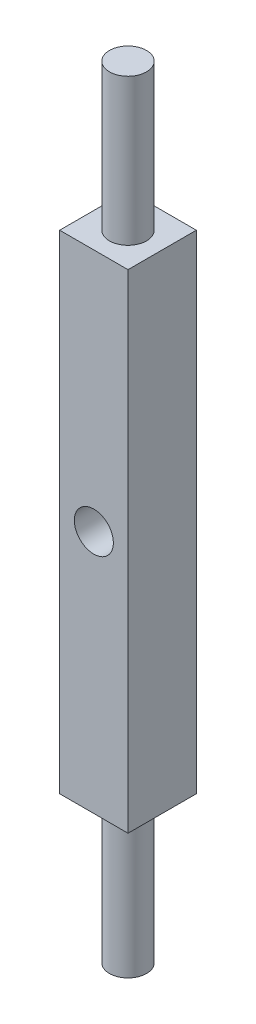
ISO-10303-21;
HEADER;
FILE_DESCRIPTION(('STEP AP214'),'2;1');
FILE_NAME('part.step','',(''),(''),'','','');
FILE_SCHEMA(('AUTOMOTIVE_DESIGN { 1 0 10303 214 1 1 1 1 }'));
ENDSEC;
DATA;
#1=APPLICATION_CONTEXT('core data for automotive mechanical design processes');
#2=APPLICATION_PROTOCOL_DEFINITION('international standard','automotive_design',2000,#1);
#3=PRODUCT_CONTEXT('',#1,'mechanical');
#4=PRODUCT('Part','Part','',(#3));
#5=PRODUCT_RELATED_PRODUCT_CATEGORY('part','',(#4));
#6=PRODUCT_DEFINITION_FORMATION('','',#4);
#7=PRODUCT_DEFINITION_CONTEXT('part definition',#1,'design');
#8=PRODUCT_DEFINITION('design','',#6,#7);
#9=PRODUCT_DEFINITION_SHAPE('','',#8);
#10=(LENGTH_UNIT() NAMED_UNIT(*) SI_UNIT(.MILLI.,.METRE.));
#11=(NAMED_UNIT(*) PLANE_ANGLE_UNIT() SI_UNIT($,.RADIAN.));
#12=(NAMED_UNIT(*) SI_UNIT($,.STERADIAN.) SOLID_ANGLE_UNIT());
#13=UNCERTAINTY_MEASURE_WITH_UNIT(LENGTH_MEASURE(1.E-05),#10,'distance_accuracy_value','');
#14=(GEOMETRIC_REPRESENTATION_CONTEXT(3) GLOBAL_UNCERTAINTY_ASSIGNED_CONTEXT((#13)) GLOBAL_UNIT_ASSIGNED_CONTEXT((#10,
#11,#12)) REPRESENTATION_CONTEXT('',''));
#15=CARTESIAN_POINT('',(0.,0.,0.));
#16=DIRECTION('',(0.,0.,1.));
#17=DIRECTION('',(1.,0.,0.));
#18=AXIS2_PLACEMENT_3D('',#15,#16,#17);
#19=CARTESIAN_POINT('',(3.5,50.,-3.5));
#20=DIRECTION('',(-1.,0.,0.));
#21=DIRECTION('',(0.,0.,1.));
#22=AXIS2_PLACEMENT_3D('',#19,#20,#21);
#23=PLANE('',#22);
#24=DIRECTION('',(0.,0.,-1.));
#25=VECTOR('',#24,1.);
#26=CARTESIAN_POINT('',(3.5,0.,-3.5));
#27=LINE('',#26,#25);
#28=CARTESIAN_POINT('',(3.5,0.,3.5));
#29=VERTEX_POINT('',#28);
#30=CARTESIAN_POINT('',(3.5,0.,-3.5));
#31=VERTEX_POINT('',#30);
#32=EDGE_CURVE('E101',#29,#31,#27,.T.);
#33=ORIENTED_EDGE('',*,*,#32,.T.);
#34=DIRECTION('',(0.,-1.,0.));
#35=VECTOR('',#34,1.);
#36=CARTESIAN_POINT('',(3.5,50.,-3.5));
#37=LINE('',#36,#35);
#38=CARTESIAN_POINT('',(3.5,50.,-3.5));
#39=VERTEX_POINT('',#38);
#40=EDGE_CURVE('E42',#39,#31,#37,.T.);
#41=ORIENTED_EDGE('',*,*,#40,.F.);
#42=DIRECTION('',(0.,0.,-1.));
#43=VECTOR('',#42,1.);
#44=CARTESIAN_POINT('',(3.5,50.,-3.5));
#45=LINE('',#44,#43);
#46=CARTESIAN_POINT('',(3.5,50.,3.5));
#47=VERTEX_POINT('',#46);
#48=EDGE_CURVE('E87',#47,#39,#45,.T.);
#49=ORIENTED_EDGE('',*,*,#48,.F.);
#50=DIRECTION('',(0.,-1.,0.));
#51=VECTOR('',#50,1.);
#52=CARTESIAN_POINT('',(3.5,50.,3.5));
#53=LINE('',#52,#51);
#54=EDGE_CURVE('E97',#47,#29,#53,.T.);
#55=ORIENTED_EDGE('',*,*,#54,.T.);
#56=EDGE_LOOP('',(#33,#41,#49,#55));
#57=FACE_BOUND('',#56,.T.);
#58=ADVANCED_FACE('F33',(#57),#23,.F.);
#59=CARTESIAN_POINT('',(-3.5,50.,-3.5));
#60=DIRECTION('',(0.,0.,1.));
#61=DIRECTION('',(1.,0.,0.));
#62=AXIS2_PLACEMENT_3D('',#59,#60,#61);
#63=PLANE('',#62);
#64=CARTESIAN_POINT('',(0.,25.0104331521772,-3.5));
#65=DIRECTION('',(0.,0.,1.));
#66=DIRECTION('',(1.,0.,0.));
#67=AXIS2_PLACEMENT_3D('',#64,#65,#66);
#68=CIRCLE('',#67,2.);
#69=CARTESIAN_POINT('',(2.00000000000004,25.0104331521772,-3.5));
#70=VERTEX_POINT('',#69);
#71=EDGE_CURVE('E146',#70,#70,#68,.T.);
#72=ORIENTED_EDGE('',*,*,#71,.T.);
#73=EDGE_LOOP('',(#72));
#74=FACE_BOUND('',#73,.T.);
#75=DIRECTION('',(-1.,0.,0.));
#76=VECTOR('',#75,1.);
#77=CARTESIAN_POINT('',(-3.5,0.,-3.5));
#78=LINE('',#77,#76);
#79=CARTESIAN_POINT('',(-3.5,0.,-3.5));
#80=VERTEX_POINT('',#79);
#81=EDGE_CURVE('E92',#31,#80,#78,.T.);
#82=ORIENTED_EDGE('',*,*,#81,.T.);
#83=DIRECTION('',(0.,-1.,0.));
#84=VECTOR('',#83,1.);
#85=CARTESIAN_POINT('',(-3.5,50.,-3.5));
#86=LINE('',#85,#84);
#87=CARTESIAN_POINT('',(-3.5,50.,-3.5));
#88=VERTEX_POINT('',#87);
#89=EDGE_CURVE('E90',#88,#80,#86,.T.);
#90=ORIENTED_EDGE('',*,*,#89,.F.);
#91=DIRECTION('',(-1.,0.,0.));
#92=VECTOR('',#91,1.);
#93=CARTESIAN_POINT('',(-3.5,50.,-3.5));
#94=LINE('',#93,#92);
#95=EDGE_CURVE('E82',#39,#88,#94,.T.);
#96=ORIENTED_EDGE('',*,*,#95,.F.);
#97=ORIENTED_EDGE('',*,*,#40,.T.);
#98=EDGE_LOOP('',(#82,#90,#96,#97));
#99=FACE_BOUND('',#98,.T.);
#100=ADVANCED_FACE('F91',(#74,#99),#63,.F.);
#101=CARTESIAN_POINT('',(-3.5,50.,-3.5));
#102=DIRECTION('',(1.,0.,0.));
#103=DIRECTION('',(0.,0.,-1.));
#104=AXIS2_PLACEMENT_3D('',#101,#102,#103);
#105=PLANE('',#104);
#106=DIRECTION('',(0.,0.,1.));
#107=VECTOR('',#106,1.);
#108=CARTESIAN_POINT('',(-3.5,0.,-3.5));
#109=LINE('',#108,#107);
#110=CARTESIAN_POINT('',(-3.5,0.,3.5));
#111=VERTEX_POINT('',#110);
#112=EDGE_CURVE('E68',#80,#111,#109,.T.);
#113=ORIENTED_EDGE('',*,*,#112,.T.);
#114=DIRECTION('',(0.,-1.,0.));
#115=VECTOR('',#114,1.);
#116=CARTESIAN_POINT('',(-3.5,50.,3.5));
#117=LINE('',#116,#115);
#118=CARTESIAN_POINT('',(-3.5,50.,3.5));
#119=VERTEX_POINT('',#118);
#120=EDGE_CURVE('E93',#119,#111,#117,.T.);
#121=ORIENTED_EDGE('',*,*,#120,.F.);
#122=DIRECTION('',(0.,0.,1.));
#123=VECTOR('',#122,1.);
#124=CARTESIAN_POINT('',(-3.5,50.,-3.5));
#125=LINE('',#124,#123);
#126=EDGE_CURVE('E85',#88,#119,#125,.T.);
#127=ORIENTED_EDGE('',*,*,#126,.F.);
#128=ORIENTED_EDGE('',*,*,#89,.T.);
#129=EDGE_LOOP('',(#113,#121,#127,#128));
#130=FACE_BOUND('',#129,.T.);
#131=ADVANCED_FACE('F95',(#130),#105,.F.);
#132=CARTESIAN_POINT('',(-3.5,50.,3.5));
#133=DIRECTION('',(0.,0.,-1.));
#134=DIRECTION('',(-1.,0.,0.));
#135=AXIS2_PLACEMENT_3D('',#132,#133,#134);
#136=PLANE('',#135);
#137=CARTESIAN_POINT('',(0.,25.0104331521772,3.5));
#138=DIRECTION('',(0.,0.,1.));
#139=DIRECTION('',(1.,0.,0.));
#140=AXIS2_PLACEMENT_3D('',#137,#138,#139);
#141=CIRCLE('',#140,2.);
#142=CARTESIAN_POINT('',(2.00000000000004,25.0104331521772,3.5));
#143=VERTEX_POINT('',#142);
#144=EDGE_CURVE('E144',#143,#143,#141,.T.);
#145=ORIENTED_EDGE('',*,*,#144,.F.);
#146=EDGE_LOOP('',(#145));
#147=FACE_BOUND('',#146,.T.);
#148=DIRECTION('',(1.,0.,0.));
#149=VECTOR('',#148,1.);
#150=CARTESIAN_POINT('',(-3.5,0.,3.5));
#151=LINE('',#150,#149);
#152=EDGE_CURVE('E74',#111,#29,#151,.T.);
#153=ORIENTED_EDGE('',*,*,#152,.T.);
#154=ORIENTED_EDGE('',*,*,#54,.F.);
#155=DIRECTION('',(1.,0.,0.));
#156=VECTOR('',#155,1.);
#157=CARTESIAN_POINT('',(-3.5,50.,3.5));
#158=LINE('',#157,#156);
#159=EDGE_CURVE('E51',#119,#47,#158,.T.);
#160=ORIENTED_EDGE('',*,*,#159,.F.);
#161=ORIENTED_EDGE('',*,*,#120,.T.);
#162=EDGE_LOOP('',(#153,#154,#160,#161));
#163=FACE_BOUND('',#162,.T.);
#164=ADVANCED_FACE('F123',(#147,#163),#136,.F.);
#165=CARTESIAN_POINT('',(0.,50.,0.));
#166=DIRECTION('',(0.,1.,0.));
#167=DIRECTION('',(0.,0.,1.));
#168=AXIS2_PLACEMENT_3D('',#165,#166,#167);
#169=PLANE('',#168);
#170=CARTESIAN_POINT('',(0.,50.,0.));
#171=DIRECTION('',(0.,1.,0.));
#172=DIRECTION('',(0.,0.,1.));
#173=AXIS2_PLACEMENT_3D('',#170,#171,#172);
#174=CIRCLE('',#173,1.9);
#175=CARTESIAN_POINT('',(0.,50.,1.9));
#176=VERTEX_POINT('',#175);
#177=EDGE_CURVE('E11',#176,#176,#174,.T.);
#178=ORIENTED_EDGE('',*,*,#177,.F.);
#179=EDGE_LOOP('',(#178));
#180=FACE_BOUND('',#179,.T.);
#181=ORIENTED_EDGE('',*,*,#48,.T.);
#182=ORIENTED_EDGE('',*,*,#95,.T.);
#183=ORIENTED_EDGE('',*,*,#126,.T.);
#184=ORIENTED_EDGE('',*,*,#159,.T.);
#185=EDGE_LOOP('',(#181,#182,#183,#184));
#186=FACE_BOUND('',#185,.T.);
#187=ADVANCED_FACE('F83',(#180,#186),#169,.T.);
#188=CARTESIAN_POINT('',(0.,0.,0.));
#189=DIRECTION('',(0.,1.,0.));
#190=DIRECTION('',(0.,0.,1.));
#191=AXIS2_PLACEMENT_3D('',#188,#189,#190);
#192=PLANE('',#191);
#193=CARTESIAN_POINT('',(0.,0.,0.));
#194=DIRECTION('',(0.,1.,0.));
#195=DIRECTION('',(0.,0.,1.));
#196=AXIS2_PLACEMENT_3D('',#193,#194,#195);
#197=CIRCLE('',#196,1.9);
#198=CARTESIAN_POINT('',(0.,0.,1.9));
#199=VERTEX_POINT('',#198);
#200=EDGE_CURVE('E36',#199,#199,#197,.T.);
#201=ORIENTED_EDGE('',*,*,#200,.T.);
#202=EDGE_LOOP('',(#201));
#203=FACE_BOUND('',#202,.T.);
#204=ORIENTED_EDGE('',*,*,#32,.F.);
#205=ORIENTED_EDGE('',*,*,#152,.F.);
#206=ORIENTED_EDGE('',*,*,#112,.F.);
#207=ORIENTED_EDGE('',*,*,#81,.F.);
#208=EDGE_LOOP('',(#204,#205,#206,#207));
#209=FACE_BOUND('',#208,.T.);
#210=ADVANCED_FACE('F111',(#203,#209),#192,.F.);
#211=CARTESIAN_POINT('',(0.,-15.,0.));
#212=DIRECTION('',(0.,-1.,0.));
#213=DIRECTION('',(0.,0.,-1.));
#214=AXIS2_PLACEMENT_3D('',#211,#212,#213);
#215=PLANE('',#214);
#216=CARTESIAN_POINT('',(0.,-15.,0.));
#217=DIRECTION('',(0.,-1.,0.));
#218=DIRECTION('',(0.,0.,-1.));
#219=AXIS2_PLACEMENT_3D('',#216,#217,#218);
#220=CIRCLE('',#219,1.9);
#221=CARTESIAN_POINT('',(0.,-15.,-1.9));
#222=VERTEX_POINT('',#221);
#223=EDGE_CURVE('E148',#222,#222,#220,.T.);
#224=ORIENTED_EDGE('',*,*,#223,.T.);
#225=EDGE_LOOP('',(#224));
#226=FACE_BOUND('',#225,.T.);
#227=ADVANCED_FACE('F113',(#226),#215,.T.);
#228=CARTESIAN_POINT('',(0.,65.,0.));
#229=DIRECTION('',(0.,-1.,0.));
#230=DIRECTION('',(0.,0.,-1.));
#231=AXIS2_PLACEMENT_3D('',#228,#229,#230);
#232=CYLINDRICAL_SURFACE('',#231,1.9);
#233=ORIENTED_EDGE('',*,*,#223,.F.);
#234=EDGE_LOOP('',(#233));
#235=FACE_BOUND('',#234,.T.);
#236=ORIENTED_EDGE('',*,*,#200,.F.);
#237=EDGE_LOOP('',(#236));
#238=FACE_BOUND('',#237,.T.);
#239=ADVANCED_FACE('F120',(#235,#238),#232,.T.);
#240=ORIENTED_EDGE('',*,*,#177,.T.);
#241=EDGE_LOOP('',(#240));
#242=FACE_BOUND('',#241,.T.);
#243=CARTESIAN_POINT('',(0.,65.,0.));
#244=DIRECTION('',(0.,-1.,0.));
#245=DIRECTION('',(0.,0.,-1.));
#246=AXIS2_PLACEMENT_3D('',#243,#244,#245);
#247=CIRCLE('',#246,1.9);
#248=CARTESIAN_POINT('',(0.,65.,-1.9));
#249=VERTEX_POINT('',#248);
#250=EDGE_CURVE('E153',#249,#249,#247,.T.);
#251=ORIENTED_EDGE('',*,*,#250,.T.);
#252=EDGE_LOOP('',(#251));
#253=FACE_BOUND('',#252,.T.);
#254=ADVANCED_FACE('F160',(#242,#253),#232,.T.);
#255=CARTESIAN_POINT('',(0.,65.,0.));
#256=DIRECTION('',(0.,-1.,0.));
#257=DIRECTION('',(0.,0.,-1.));
#258=AXIS2_PLACEMENT_3D('',#255,#256,#257);
#259=PLANE('',#258);
#260=ORIENTED_EDGE('',*,*,#250,.F.);
#261=EDGE_LOOP('',(#260));
#262=FACE_BOUND('',#261,.T.);
#263=ADVANCED_FACE('F166',(#262),#259,.F.);
#264=CARTESIAN_POINT('',(0.,25.0104331521772,-6.5));
#265=DIRECTION('',(0.,0.,1.));
#266=DIRECTION('',(1.,0.,0.));
#267=AXIS2_PLACEMENT_3D('',#264,#265,#266);
#268=CYLINDRICAL_SURFACE('',#267,2.);
#269=ORIENTED_EDGE('',*,*,#144,.T.);
#270=EDGE_LOOP('',(#269));
#271=FACE_BOUND('',#270,.T.);
#272=ORIENTED_EDGE('',*,*,#71,.F.);
#273=EDGE_LOOP('',(#272));
#274=FACE_BOUND('',#273,.T.);
#275=ADVANCED_FACE('F171',(#271,#274),#268,.F.);
#276=CLOSED_SHELL('',(#58,#100,#131,#164,#187,#210,#227,#239,#254,#263,#275));
#277=MANIFOLD_SOLID_BREP('B2',#276);
#278=ADVANCED_BREP_SHAPE_REPRESENTATION('',(#18,#277),#14);
#279=SHAPE_DEFINITION_REPRESENTATION(#9,#278);
ENDSEC;
END-ISO-10303-21;
